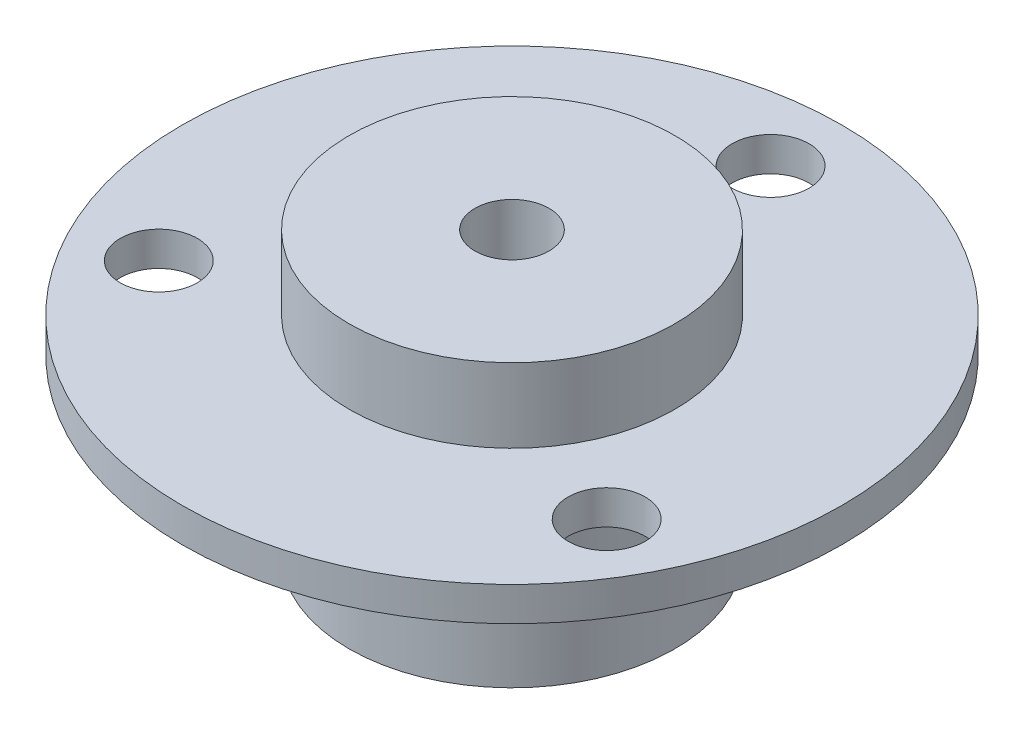
ISO-10303-21;
HEADER;
FILE_DESCRIPTION(('STEP AP214'),'2;1');
FILE_NAME('part.step','',(''),(''),'','','');
FILE_SCHEMA(('AUTOMOTIVE_DESIGN { 1 0 10303 214 1 1 1 1 }'));
ENDSEC;
DATA;
#1=APPLICATION_CONTEXT('core data for automotive mechanical design processes');
#2=APPLICATION_PROTOCOL_DEFINITION('international standard','automotive_design',2000,#1);
#3=PRODUCT_CONTEXT('',#1,'mechanical');
#4=PRODUCT('Part','Part','',(#3));
#5=PRODUCT_RELATED_PRODUCT_CATEGORY('part','',(#4));
#6=PRODUCT_DEFINITION_FORMATION('','',#4);
#7=PRODUCT_DEFINITION_CONTEXT('part definition',#1,'design');
#8=PRODUCT_DEFINITION('design','',#6,#7);
#9=PRODUCT_DEFINITION_SHAPE('','',#8);
#10=(LENGTH_UNIT() NAMED_UNIT(*) SI_UNIT(.MILLI.,.METRE.));
#11=(NAMED_UNIT(*) PLANE_ANGLE_UNIT() SI_UNIT($,.RADIAN.));
#12=(NAMED_UNIT(*) SI_UNIT($,.STERADIAN.) SOLID_ANGLE_UNIT());
#13=UNCERTAINTY_MEASURE_WITH_UNIT(LENGTH_MEASURE(1.E-05),#10,'distance_accuracy_value','');
#14=(GEOMETRIC_REPRESENTATION_CONTEXT(3) GLOBAL_UNCERTAINTY_ASSIGNED_CONTEXT((#13)) GLOBAL_UNIT_ASSIGNED_CONTEXT((#10,
#11,#12)) REPRESENTATION_CONTEXT('',''));
#15=CARTESIAN_POINT('',(0.,0.,0.));
#16=DIRECTION('',(0.,0.,1.));
#17=DIRECTION('',(1.,0.,0.));
#18=AXIS2_PLACEMENT_3D('',#15,#16,#17);
#19=CARTESIAN_POINT('',(0.,-19.,0.));
#20=DIRECTION('',(0.,1.,0.));
#21=DIRECTION('',(0.,0.,1.));
#22=AXIS2_PLACEMENT_3D('',#19,#20,#21);
#23=CYLINDRICAL_SURFACE('',#22,11.);
#24=CARTESIAN_POINT('',(0.,-19.,0.));
#25=DIRECTION('',(0.,1.,0.));
#26=DIRECTION('',(0.,0.,1.));
#27=AXIS2_PLACEMENT_3D('',#24,#25,#26);
#28=CIRCLE('',#27,11.);
#29=CARTESIAN_POINT('',(0.,-19.,11.));
#30=VERTEX_POINT('',#29);
#31=EDGE_CURVE('E41',#30,#30,#28,.T.);
#32=ORIENTED_EDGE('',*,*,#31,.T.);
#33=EDGE_LOOP('',(#32));
#34=FACE_BOUND('',#33,.T.);
#35=CARTESIAN_POINT('',(0.,-7.3,0.));
#36=DIRECTION('',(0.,1.,0.));
#37=DIRECTION('',(0.,0.,1.));
#38=AXIS2_PLACEMENT_3D('',#35,#36,#37);
#39=CIRCLE('',#38,11.);
#40=CARTESIAN_POINT('',(0.,-7.3,11.));
#41=VERTEX_POINT('',#40);
#42=EDGE_CURVE('E37',#41,#41,#39,.F.);
#43=ORIENTED_EDGE('',*,*,#42,.T.);
#44=EDGE_LOOP('',(#43));
#45=FACE_BOUND('',#44,.T.);
#46=ADVANCED_FACE('F33',(#34,#45),#23,.T.);
#47=CARTESIAN_POINT('',(0.,-19.,0.));
#48=DIRECTION('',(0.,1.,0.));
#49=DIRECTION('',(0.,0.,1.));
#50=AXIS2_PLACEMENT_3D('',#47,#48,#49);
#51=PLANE('',#50);
#52=CARTESIAN_POINT('',(0.,-19.,0.));
#53=DIRECTION('',(0.,1.,0.));
#54=DIRECTION('',(0.,0.,1.));
#55=AXIS2_PLACEMENT_3D('',#52,#53,#54);
#56=CIRCLE('',#55,2.5);
#57=CARTESIAN_POINT('',(0.,-19.,2.5));
#58=VERTEX_POINT('',#57);
#59=EDGE_CURVE('E70',#58,#58,#56,.T.);
#60=ORIENTED_EDGE('',*,*,#59,.T.);
#61=EDGE_LOOP('',(#60));
#62=FACE_BOUND('',#61,.T.);
#63=ORIENTED_EDGE('',*,*,#31,.F.);
#64=EDGE_LOOP('',(#63));
#65=FACE_BOUND('',#64,.T.);
#66=ADVANCED_FACE('F81',(#62,#65),#51,.F.);
#67=CARTESIAN_POINT('',(0.,-7.3,0.));
#68=DIRECTION('',(0.,1.,0.));
#69=DIRECTION('',(0.,0.,1.));
#70=AXIS2_PLACEMENT_3D('',#67,#68,#69);
#71=CYLINDRICAL_SURFACE('',#70,22.25);
#72=CARTESIAN_POINT('',(0.,-7.3,0.));
#73=DIRECTION('',(0.,1.,0.));
#74=DIRECTION('',(0.,0.,1.));
#75=AXIS2_PLACEMENT_3D('',#72,#73,#74);
#76=CIRCLE('',#75,22.25);
#77=CARTESIAN_POINT('',(0.,-7.3,22.25));
#78=VERTEX_POINT('',#77);
#79=EDGE_CURVE('E53',#78,#78,#76,.T.);
#80=ORIENTED_EDGE('',*,*,#79,.T.);
#81=EDGE_LOOP('',(#80));
#82=FACE_BOUND('',#81,.T.);
#83=CARTESIAN_POINT('',(0.,-5.,0.));
#84=DIRECTION('',(0.,1.,0.));
#85=DIRECTION('',(0.,0.,1.));
#86=AXIS2_PLACEMENT_3D('',#83,#84,#85);
#87=CIRCLE('',#86,22.25);
#88=CARTESIAN_POINT('',(0.,-5.,22.25));
#89=VERTEX_POINT('',#88);
#90=EDGE_CURVE('E50',#89,#89,#87,.T.);
#91=ORIENTED_EDGE('',*,*,#90,.F.);
#92=EDGE_LOOP('',(#91));
#93=FACE_BOUND('',#92,.T.);
#94=ADVANCED_FACE('F113',(#82,#93),#71,.T.);
#95=CARTESIAN_POINT('',(0.,-7.3,0.));
#96=DIRECTION('',(0.,1.,0.));
#97=DIRECTION('',(0.,0.,1.));
#98=AXIS2_PLACEMENT_3D('',#95,#96,#97);
#99=PLANE('',#98);
#100=CARTESIAN_POINT('',(0.,-7.3,-17.45));
#101=DIRECTION('',(0.,1.,0.));
#102=DIRECTION('',(0.,0.,1.));
#103=AXIS2_PLACEMENT_3D('',#100,#101,#102);
#104=CIRCLE('',#103,2.6);
#105=CARTESIAN_POINT('',(0.,-7.3,-14.85));
#106=VERTEX_POINT('',#105);
#107=EDGE_CURVE('E54',#106,#106,#104,.T.);
#108=ORIENTED_EDGE('',*,*,#107,.T.);
#109=EDGE_LOOP('',(#108));
#110=FACE_BOUND('',#109,.T.);
#111=CARTESIAN_POINT('',(15.1121432960396,-7.3,8.72499999999936));
#112=DIRECTION('',(0.,1.,0.));
#113=DIRECTION('',(0.,0.,1.));
#114=AXIS2_PLACEMENT_3D('',#111,#112,#113);
#115=CIRCLE('',#114,2.60000000000095);
#116=CARTESIAN_POINT('',(15.1121432960396,-7.3,11.3250000000003));
#117=VERTEX_POINT('',#116);
#118=EDGE_CURVE('E59',#117,#117,#115,.T.);
#119=ORIENTED_EDGE('',*,*,#118,.T.);
#120=EDGE_LOOP('',(#119));
#121=FACE_BOUND('',#120,.T.);
#122=CARTESIAN_POINT('',(-15.1121432960373,-7.3,8.72500000000065));
#123=DIRECTION('',(0.,1.,0.));
#124=DIRECTION('',(0.,0.,1.));
#125=AXIS2_PLACEMENT_3D('',#122,#123,#124);
#126=CIRCLE('',#125,2.60000000000142);
#127=CARTESIAN_POINT('',(-15.1121432960373,-7.3,11.3250000000021));
#128=VERTEX_POINT('',#127);
#129=EDGE_CURVE('E62',#128,#128,#126,.T.);
#130=ORIENTED_EDGE('',*,*,#129,.T.);
#131=EDGE_LOOP('',(#130));
#132=FACE_BOUND('',#131,.T.);
#133=ORIENTED_EDGE('',*,*,#42,.F.);
#134=EDGE_LOOP('',(#133));
#135=FACE_BOUND('',#134,.T.);
#136=ORIENTED_EDGE('',*,*,#79,.F.);
#137=EDGE_LOOP('',(#136));
#138=FACE_BOUND('',#137,.T.);
#139=ADVANCED_FACE('F120',(#110,#121,#132,#135,#138),#99,.F.);
#140=CARTESIAN_POINT('',(0.,-5.,0.));
#141=DIRECTION('',(0.,1.,0.));
#142=DIRECTION('',(0.,0.,1.));
#143=AXIS2_PLACEMENT_3D('',#140,#141,#142);
#144=PLANE('',#143);
#145=CARTESIAN_POINT('',(0.,-5.,-17.45));
#146=DIRECTION('',(0.,1.,0.));
#147=DIRECTION('',(0.,0.,1.));
#148=AXIS2_PLACEMENT_3D('',#145,#146,#147);
#149=CIRCLE('',#148,2.6);
#150=CARTESIAN_POINT('',(0.,-5.,-14.85));
#151=VERTEX_POINT('',#150);
#152=EDGE_CURVE('E65',#151,#151,#149,.T.);
#153=ORIENTED_EDGE('',*,*,#152,.F.);
#154=EDGE_LOOP('',(#153));
#155=FACE_BOUND('',#154,.T.);
#156=CARTESIAN_POINT('',(15.1121432960396,-5.,8.72499999999936));
#157=DIRECTION('',(0.,1.,0.));
#158=DIRECTION('',(0.,0.,1.));
#159=AXIS2_PLACEMENT_3D('',#156,#157,#158);
#160=CIRCLE('',#159,2.60000000000095);
#161=CARTESIAN_POINT('',(15.1121432960396,-5.,11.3250000000003));
#162=VERTEX_POINT('',#161);
#163=EDGE_CURVE('E69',#162,#162,#160,.T.);
#164=ORIENTED_EDGE('',*,*,#163,.F.);
#165=EDGE_LOOP('',(#164));
#166=FACE_BOUND('',#165,.T.);
#167=CARTESIAN_POINT('',(-15.1121432960373,-5.,8.72500000000065));
#168=DIRECTION('',(0.,1.,0.));
#169=DIRECTION('',(0.,0.,1.));
#170=AXIS2_PLACEMENT_3D('',#167,#168,#169);
#171=CIRCLE('',#170,2.60000000000142);
#172=CARTESIAN_POINT('',(-15.1121432960373,-5.,11.3250000000021));
#173=VERTEX_POINT('',#172);
#174=EDGE_CURVE('E66',#173,#173,#171,.T.);
#175=ORIENTED_EDGE('',*,*,#174,.F.);
#176=EDGE_LOOP('',(#175));
#177=FACE_BOUND('',#176,.T.);
#178=CARTESIAN_POINT('',(0.,-5.,0.));
#179=DIRECTION('',(0.,1.,0.));
#180=DIRECTION('',(0.,0.,1.));
#181=AXIS2_PLACEMENT_3D('',#178,#179,#180);
#182=CIRCLE('',#181,11.);
#183=CARTESIAN_POINT('',(0.,-5.,11.));
#184=VERTEX_POINT('',#183);
#185=EDGE_CURVE('E10',#184,#184,#182,.F.);
#186=ORIENTED_EDGE('',*,*,#185,.T.);
#187=EDGE_LOOP('',(#186));
#188=FACE_BOUND('',#187,.T.);
#189=ORIENTED_EDGE('',*,*,#90,.T.);
#190=EDGE_LOOP('',(#189));
#191=FACE_BOUND('',#190,.T.);
#192=ADVANCED_FACE('F94',(#155,#166,#177,#188,#191),#144,.T.);
#193=CARTESIAN_POINT('',(0.,0.,0.));
#194=DIRECTION('',(0.,1.,0.));
#195=DIRECTION('',(0.,0.,1.));
#196=AXIS2_PLACEMENT_3D('',#193,#194,#195);
#197=PLANE('',#196);
#198=CARTESIAN_POINT('',(0.,0.,0.));
#199=DIRECTION('',(0.,1.,0.));
#200=DIRECTION('',(0.,0.,1.));
#201=AXIS2_PLACEMENT_3D('',#198,#199,#200);
#202=CIRCLE('',#201,2.5);
#203=CARTESIAN_POINT('',(0.,0.,2.5));
#204=VERTEX_POINT('',#203);
#205=EDGE_CURVE('E75',#204,#204,#202,.T.);
#206=ORIENTED_EDGE('',*,*,#205,.F.);
#207=EDGE_LOOP('',(#206));
#208=FACE_BOUND('',#207,.T.);
#209=CARTESIAN_POINT('',(0.,0.,0.));
#210=DIRECTION('',(0.,1.,0.));
#211=DIRECTION('',(0.,0.,1.));
#212=AXIS2_PLACEMENT_3D('',#209,#210,#211);
#213=CIRCLE('',#212,11.);
#214=CARTESIAN_POINT('',(0.,0.,11.));
#215=VERTEX_POINT('',#214);
#216=EDGE_CURVE('E45',#215,#215,#213,.T.);
#217=ORIENTED_EDGE('',*,*,#216,.T.);
#218=EDGE_LOOP('',(#217));
#219=FACE_BOUND('',#218,.T.);
#220=ADVANCED_FACE('F91',(#208,#219),#197,.T.);
#221=ORIENTED_EDGE('',*,*,#185,.F.);
#222=EDGE_LOOP('',(#221));
#223=FACE_BOUND('',#222,.T.);
#224=ORIENTED_EDGE('',*,*,#216,.F.);
#225=EDGE_LOOP('',(#224));
#226=FACE_BOUND('',#225,.T.);
#227=ADVANCED_FACE('F35',(#223,#226),#23,.T.);
#228=CARTESIAN_POINT('',(-15.1121432960373,-19.,8.72500000000065));
#229=DIRECTION('',(0.,1.,0.));
#230=DIRECTION('',(0.,0.,1.));
#231=AXIS2_PLACEMENT_3D('',#228,#229,#230);
#232=CYLINDRICAL_SURFACE('',#231,2.60000000000142);
#233=CARTESIAN_POINT('',(-15.1121432960373,-5.,11.3250000000021));
#234=CARTESIAN_POINT('',(-15.1121432960373,-5.02395833333333,11.3250000000021));
#235=CARTESIAN_POINT('',(-15.1121432960373,-5.04791666666667,11.3250000000021));
#236=CARTESIAN_POINT('',(-15.1121432960373,-5.09583333333333,11.3250000000021));
#237=CARTESIAN_POINT('',(-15.1121432960373,-5.11979166666667,11.3250000000021));
#238=CARTESIAN_POINT('',(-15.1121432960373,-5.16770833333333,11.3250000000021));
#239=CARTESIAN_POINT('',(-15.1121432960373,-5.19166666666667,11.3250000000021));
#240=CARTESIAN_POINT('',(-15.1121432960373,-5.23958333333333,11.3250000000021));
#241=CARTESIAN_POINT('',(-15.1121432960373,-5.26354166666667,11.3250000000021));
#242=CARTESIAN_POINT('',(-15.1121432960373,-5.31145833333333,11.3250000000021));
#243=CARTESIAN_POINT('',(-15.1121432960373,-5.33541666666667,11.3250000000021));
#244=CARTESIAN_POINT('',(-15.1121432960373,-5.38333333333333,11.3250000000021));
#245=CARTESIAN_POINT('',(-15.1121432960373,-5.40729166666667,11.3250000000021));
#246=CARTESIAN_POINT('',(-15.1121432960373,-5.45520833333333,11.3250000000021));
#247=CARTESIAN_POINT('',(-15.1121432960373,-5.47916666666667,11.3250000000021));
#248=CARTESIAN_POINT('',(-15.1121432960373,-5.52708333333333,11.3250000000021));
#249=CARTESIAN_POINT('',(-15.1121432960373,-5.55104166666667,11.3250000000021));
#250=CARTESIAN_POINT('',(-15.1121432960373,-5.59895833333333,11.3250000000021));
#251=CARTESIAN_POINT('',(-15.1121432960373,-5.62291666666667,11.3250000000021));
#252=CARTESIAN_POINT('',(-15.1121432960373,-5.67083333333333,11.3250000000021));
#253=CARTESIAN_POINT('',(-15.1121432960373,-5.69479166666667,11.3250000000021));
#254=CARTESIAN_POINT('',(-15.1121432960373,-5.74270833333333,11.3250000000021));
#255=CARTESIAN_POINT('',(-15.1121432960373,-5.76666666666667,11.3250000000021));
#256=CARTESIAN_POINT('',(-15.1121432960373,-5.81458333333333,11.3250000000021));
#257=CARTESIAN_POINT('',(-15.1121432960373,-5.83854166666667,11.3250000000021));
#258=CARTESIAN_POINT('',(-15.1121432960373,-5.88645833333333,11.3250000000021));
#259=CARTESIAN_POINT('',(-15.1121432960373,-5.91041666666667,11.3250000000021));
#260=CARTESIAN_POINT('',(-15.1121432960373,-5.95833333333333,11.3250000000021));
#261=CARTESIAN_POINT('',(-15.1121432960373,-5.98229166666667,11.3250000000021));
#262=CARTESIAN_POINT('',(-15.1121432960373,-6.03020833333333,11.3250000000021));
#263=CARTESIAN_POINT('',(-15.1121432960373,-6.05416666666667,11.3250000000021));
#264=CARTESIAN_POINT('',(-15.1121432960373,-6.10208333333333,11.3250000000021));
#265=CARTESIAN_POINT('',(-15.1121432960373,-6.12604166666667,11.3250000000021));
#266=CARTESIAN_POINT('',(-15.1121432960373,-6.17395833333333,11.3250000000021));
#267=CARTESIAN_POINT('',(-15.1121432960373,-6.19791666666667,11.3250000000021));
#268=CARTESIAN_POINT('',(-15.1121432960373,-6.24583333333334,11.3250000000021));
#269=CARTESIAN_POINT('',(-15.1121432960373,-6.26979166666667,11.3250000000021));
#270=CARTESIAN_POINT('',(-15.1121432960373,-6.31770833333333,11.3250000000021));
#271=CARTESIAN_POINT('',(-15.1121432960373,-6.34166666666667,11.3250000000021));
#272=CARTESIAN_POINT('',(-15.1121432960373,-6.38958333333334,11.3250000000021));
#273=CARTESIAN_POINT('',(-15.1121432960373,-6.41354166666667,11.3250000000021));
#274=CARTESIAN_POINT('',(-15.1121432960373,-6.46145833333333,11.3250000000021));
#275=CARTESIAN_POINT('',(-15.1121432960373,-6.48541666666667,11.3250000000021));
#276=CARTESIAN_POINT('',(-15.1121432960373,-6.53333333333333,11.3250000000021));
#277=CARTESIAN_POINT('',(-15.1121432960373,-6.55729166666667,11.3250000000021));
#278=CARTESIAN_POINT('',(-15.1121432960373,-6.60520833333334,11.3250000000021));
#279=CARTESIAN_POINT('',(-15.1121432960373,-6.62916666666667,11.3250000000021));
#280=CARTESIAN_POINT('',(-15.1121432960373,-6.67708333333333,11.3250000000021));
#281=CARTESIAN_POINT('',(-15.1121432960373,-6.70104166666667,11.3250000000021));
#282=CARTESIAN_POINT('',(-15.1121432960373,-6.74895833333334,11.3250000000021));
#283=CARTESIAN_POINT('',(-15.1121432960373,-6.77291666666667,11.3250000000021));
#284=CARTESIAN_POINT('',(-15.1121432960373,-6.82083333333334,11.3250000000021));
#285=CARTESIAN_POINT('',(-15.1121432960373,-6.84479166666667,11.3250000000021));
#286=CARTESIAN_POINT('',(-15.1121432960373,-6.89270833333333,11.3250000000021));
#287=CARTESIAN_POINT('',(-15.1121432960373,-6.91666666666667,11.3250000000021));
#288=CARTESIAN_POINT('',(-15.1121432960373,-6.96458333333334,11.3250000000021));
#289=CARTESIAN_POINT('',(-15.1121432960373,-6.98854166666667,11.3250000000021));
#290=CARTESIAN_POINT('',(-15.1121432960373,-7.03645833333334,11.3250000000021));
#291=CARTESIAN_POINT('',(-15.1121432960373,-7.06041666666667,11.3250000000021));
#292=CARTESIAN_POINT('',(-15.1121432960373,-7.10833333333334,11.3250000000021));
#293=CARTESIAN_POINT('',(-15.1121432960373,-7.13229166666667,11.3250000000021));
#294=CARTESIAN_POINT('',(-15.1121432960373,-7.18020833333334,11.3250000000021));
#295=CARTESIAN_POINT('',(-15.1121432960373,-7.20416666666667,11.3250000000021));
#296=CARTESIAN_POINT('',(-15.1121432960373,-7.25208333333334,11.3250000000021));
#297=CARTESIAN_POINT('',(-15.1121432960373,-7.27604166666667,11.3250000000021));
#298=CARTESIAN_POINT('',(-15.1121432960373,-7.3,11.3250000000021));
#299=B_SPLINE_CURVE_WITH_KNOTS('',3,(#233,#234,#235,#236,#237,#238,#239,#240,#241,#242,#243,
#244,#245,#246,#247,#248,#249,#250,#251,#252,#253,#254,#255,#256,#257,#258,#259,#260,#261,#262,
#263,#264,#265,#266,#267,#268,#269,#270,#271,#272,#273,#274,#275,#276,#277,#278,#279,#280,#281,
#282,#283,#284,#285,#286,#287,#288,#289,#290,#291,#292,#293,#294,#295,#296,#297,#298),
.UNSPECIFIED.,.F.,.F.,(4,2,2,2,2,2,2,2,2,2,2,2,2,2,2,2,2,2,2,2,2,2,2,2,2,2,2,2,2,2,2,2,4),(0.,
0.0718750000000008,0.14375,0.215625000000001,0.2875,0.359375,0.431250000000001,0.503125,
0.575000000000001,0.646875000000002,0.718750000000001,0.790625000000001,0.862500000000002,
0.934375000000001,1.00625,1.078125,1.15,1.221875,1.29375,1.365625,1.4375,1.509375,1.58125,
1.653125,1.725,1.796875,1.86875,1.940625,2.0125,2.084375,2.15625,2.228125,2.3),.UNSPECIFIED.);
#300=EDGE_CURVE('BSEAM98',#173,#128,#299,.T.);
#301=ORIENTED_EDGE('',*,*,#174,.T.);
#302=ORIENTED_EDGE('',*,*,#129,.F.);
#303=ORIENTED_EDGE('',*,*,#300,.T.);
#304=ORIENTED_EDGE('',*,*,#300,.F.);
#305=EDGE_LOOP('',(#301,#303,#302,#304));
#306=FACE_BOUND('',#305,.T.);
#307=ADVANCED_FACE('F98',(#306),#232,.F.);
#308=CARTESIAN_POINT('',(15.1121432960396,-19.,8.72499999999936));
#309=DIRECTION('',(0.,1.,0.));
#310=DIRECTION('',(0.,0.,1.));
#311=AXIS2_PLACEMENT_3D('',#308,#309,#310);
#312=CYLINDRICAL_SURFACE('',#311,2.60000000000095);
#313=CARTESIAN_POINT('',(15.1121432960396,-5.,11.3250000000003));
#314=CARTESIAN_POINT('',(15.1121432960396,-5.02395833333333,11.3250000000003));
#315=CARTESIAN_POINT('',(15.1121432960396,-5.04791666666667,11.3250000000003));
#316=CARTESIAN_POINT('',(15.1121432960396,-5.09583333333333,11.3250000000003));
#317=CARTESIAN_POINT('',(15.1121432960396,-5.11979166666667,11.3250000000003));
#318=CARTESIAN_POINT('',(15.1121432960396,-5.16770833333333,11.3250000000003));
#319=CARTESIAN_POINT('',(15.1121432960396,-5.19166666666667,11.3250000000003));
#320=CARTESIAN_POINT('',(15.1121432960396,-5.23958333333333,11.3250000000003));
#321=CARTESIAN_POINT('',(15.1121432960396,-5.26354166666667,11.3250000000003));
#322=CARTESIAN_POINT('',(15.1121432960396,-5.31145833333333,11.3250000000003));
#323=CARTESIAN_POINT('',(15.1121432960396,-5.33541666666667,11.3250000000003));
#324=CARTESIAN_POINT('',(15.1121432960396,-5.38333333333333,11.3250000000003));
#325=CARTESIAN_POINT('',(15.1121432960396,-5.40729166666667,11.3250000000003));
#326=CARTESIAN_POINT('',(15.1121432960396,-5.45520833333333,11.3250000000003));
#327=CARTESIAN_POINT('',(15.1121432960396,-5.47916666666667,11.3250000000003));
#328=CARTESIAN_POINT('',(15.1121432960396,-5.52708333333333,11.3250000000003));
#329=CARTESIAN_POINT('',(15.1121432960396,-5.55104166666667,11.3250000000003));
#330=CARTESIAN_POINT('',(15.1121432960396,-5.59895833333333,11.3250000000003));
#331=CARTESIAN_POINT('',(15.1121432960396,-5.62291666666667,11.3250000000003));
#332=CARTESIAN_POINT('',(15.1121432960396,-5.67083333333333,11.3250000000003));
#333=CARTESIAN_POINT('',(15.1121432960396,-5.69479166666667,11.3250000000003));
#334=CARTESIAN_POINT('',(15.1121432960396,-5.74270833333333,11.3250000000003));
#335=CARTESIAN_POINT('',(15.1121432960396,-5.76666666666667,11.3250000000003));
#336=CARTESIAN_POINT('',(15.1121432960396,-5.81458333333333,11.3250000000003));
#337=CARTESIAN_POINT('',(15.1121432960396,-5.83854166666667,11.3250000000003));
#338=CARTESIAN_POINT('',(15.1121432960396,-5.88645833333333,11.3250000000003));
#339=CARTESIAN_POINT('',(15.1121432960396,-5.91041666666667,11.3250000000003));
#340=CARTESIAN_POINT('',(15.1121432960396,-5.95833333333333,11.3250000000003));
#341=CARTESIAN_POINT('',(15.1121432960396,-5.98229166666667,11.3250000000003));
#342=CARTESIAN_POINT('',(15.1121432960396,-6.03020833333333,11.3250000000003));
#343=CARTESIAN_POINT('',(15.1121432960396,-6.05416666666667,11.3250000000003));
#344=CARTESIAN_POINT('',(15.1121432960396,-6.10208333333333,11.3250000000003));
#345=CARTESIAN_POINT('',(15.1121432960396,-6.12604166666667,11.3250000000003));
#346=CARTESIAN_POINT('',(15.1121432960396,-6.17395833333333,11.3250000000003));
#347=CARTESIAN_POINT('',(15.1121432960396,-6.19791666666667,11.3250000000003));
#348=CARTESIAN_POINT('',(15.1121432960396,-6.24583333333334,11.3250000000003));
#349=CARTESIAN_POINT('',(15.1121432960396,-6.26979166666667,11.3250000000003));
#350=CARTESIAN_POINT('',(15.1121432960396,-6.31770833333333,11.3250000000003));
#351=CARTESIAN_POINT('',(15.1121432960396,-6.34166666666667,11.3250000000003));
#352=CARTESIAN_POINT('',(15.1121432960396,-6.38958333333334,11.3250000000003));
#353=CARTESIAN_POINT('',(15.1121432960396,-6.41354166666667,11.3250000000003));
#354=CARTESIAN_POINT('',(15.1121432960396,-6.46145833333333,11.3250000000003));
#355=CARTESIAN_POINT('',(15.1121432960396,-6.48541666666667,11.3250000000003));
#356=CARTESIAN_POINT('',(15.1121432960396,-6.53333333333333,11.3250000000003));
#357=CARTESIAN_POINT('',(15.1121432960396,-6.55729166666667,11.3250000000003));
#358=CARTESIAN_POINT('',(15.1121432960396,-6.60520833333334,11.3250000000003));
#359=CARTESIAN_POINT('',(15.1121432960396,-6.62916666666667,11.3250000000003));
#360=CARTESIAN_POINT('',(15.1121432960396,-6.67708333333333,11.3250000000003));
#361=CARTESIAN_POINT('',(15.1121432960396,-6.70104166666667,11.3250000000003));
#362=CARTESIAN_POINT('',(15.1121432960396,-6.74895833333334,11.3250000000003));
#363=CARTESIAN_POINT('',(15.1121432960396,-6.77291666666667,11.3250000000003));
#364=CARTESIAN_POINT('',(15.1121432960396,-6.82083333333334,11.3250000000003));
#365=CARTESIAN_POINT('',(15.1121432960396,-6.84479166666667,11.3250000000003));
#366=CARTESIAN_POINT('',(15.1121432960396,-6.89270833333333,11.3250000000003));
#367=CARTESIAN_POINT('',(15.1121432960396,-6.91666666666667,11.3250000000003));
#368=CARTESIAN_POINT('',(15.1121432960396,-6.96458333333334,11.3250000000003));
#369=CARTESIAN_POINT('',(15.1121432960396,-6.98854166666667,11.3250000000003));
#370=CARTESIAN_POINT('',(15.1121432960396,-7.03645833333334,11.3250000000003));
#371=CARTESIAN_POINT('',(15.1121432960396,-7.06041666666667,11.3250000000003));
#372=CARTESIAN_POINT('',(15.1121432960396,-7.10833333333334,11.3250000000003));
#373=CARTESIAN_POINT('',(15.1121432960396,-7.13229166666667,11.3250000000003));
#374=CARTESIAN_POINT('',(15.1121432960396,-7.18020833333334,11.3250000000003));
#375=CARTESIAN_POINT('',(15.1121432960396,-7.20416666666667,11.3250000000003));
#376=CARTESIAN_POINT('',(15.1121432960396,-7.25208333333334,11.3250000000003));
#377=CARTESIAN_POINT('',(15.1121432960396,-7.27604166666667,11.3250000000003));
#378=CARTESIAN_POINT('',(15.1121432960396,-7.3,11.3250000000003));
#379=B_SPLINE_CURVE_WITH_KNOTS('',3,(#313,#314,#315,#316,#317,#318,#319,#320,#321,#322,#323,
#324,#325,#326,#327,#328,#329,#330,#331,#332,#333,#334,#335,#336,#337,#338,#339,#340,#341,#342,
#343,#344,#345,#346,#347,#348,#349,#350,#351,#352,#353,#354,#355,#356,#357,#358,#359,#360,#361,
#362,#363,#364,#365,#366,#367,#368,#369,#370,#371,#372,#373,#374,#375,#376,#377,#378),
.UNSPECIFIED.,.F.,.F.,(4,2,2,2,2,2,2,2,2,2,2,2,2,2,2,2,2,2,2,2,2,2,2,2,2,2,2,2,2,2,2,2,4),(0.,
0.0718750000000008,0.14375,0.215625000000001,0.2875,0.359375,0.431250000000001,0.503125,
0.575000000000001,0.646875000000002,0.718750000000001,0.790625000000001,0.862500000000002,
0.934375000000001,1.00625,1.078125,1.15,1.221875,1.29375,1.365625,1.4375,1.509375,1.58125,
1.653125,1.725,1.796875,1.86875,1.940625,2.0125,2.084375,2.15625,2.228125,2.3),.UNSPECIFIED.);
#380=EDGE_CURVE('BSEAM104',#162,#117,#379,.T.);
#381=ORIENTED_EDGE('',*,*,#163,.T.);
#382=ORIENTED_EDGE('',*,*,#118,.F.);
#383=ORIENTED_EDGE('',*,*,#380,.T.);
#384=ORIENTED_EDGE('',*,*,#380,.F.);
#385=EDGE_LOOP('',(#381,#383,#382,#384));
#386=FACE_BOUND('',#385,.T.);
#387=ADVANCED_FACE('F104',(#386),#312,.F.);
#388=CARTESIAN_POINT('',(0.,-19.,-17.45));
#389=DIRECTION('',(0.,1.,0.));
#390=DIRECTION('',(0.,0.,1.));
#391=AXIS2_PLACEMENT_3D('',#388,#389,#390);
#392=CYLINDRICAL_SURFACE('',#391,2.6);
#393=CARTESIAN_POINT('',(0.,-5.,-14.85));
#394=CARTESIAN_POINT('',(0.,-5.02395833333333,-14.85));
#395=CARTESIAN_POINT('',(0.,-5.04791666666667,-14.85));
#396=CARTESIAN_POINT('',(0.,-5.09583333333333,-14.85));
#397=CARTESIAN_POINT('',(0.,-5.11979166666667,-14.85));
#398=CARTESIAN_POINT('',(0.,-5.16770833333333,-14.85));
#399=CARTESIAN_POINT('',(0.,-5.19166666666667,-14.85));
#400=CARTESIAN_POINT('',(0.,-5.23958333333333,-14.85));
#401=CARTESIAN_POINT('',(0.,-5.26354166666667,-14.85));
#402=CARTESIAN_POINT('',(0.,-5.31145833333333,-14.85));
#403=CARTESIAN_POINT('',(0.,-5.33541666666667,-14.85));
#404=CARTESIAN_POINT('',(0.,-5.38333333333333,-14.85));
#405=CARTESIAN_POINT('',(0.,-5.40729166666667,-14.85));
#406=CARTESIAN_POINT('',(0.,-5.45520833333333,-14.85));
#407=CARTESIAN_POINT('',(0.,-5.47916666666667,-14.85));
#408=CARTESIAN_POINT('',(0.,-5.52708333333333,-14.85));
#409=CARTESIAN_POINT('',(0.,-5.55104166666667,-14.85));
#410=CARTESIAN_POINT('',(0.,-5.59895833333333,-14.85));
#411=CARTESIAN_POINT('',(0.,-5.62291666666667,-14.85));
#412=CARTESIAN_POINT('',(0.,-5.67083333333333,-14.85));
#413=CARTESIAN_POINT('',(0.,-5.69479166666667,-14.85));
#414=CARTESIAN_POINT('',(0.,-5.74270833333333,-14.85));
#415=CARTESIAN_POINT('',(0.,-5.76666666666667,-14.85));
#416=CARTESIAN_POINT('',(0.,-5.81458333333333,-14.85));
#417=CARTESIAN_POINT('',(0.,-5.83854166666667,-14.85));
#418=CARTESIAN_POINT('',(0.,-5.88645833333333,-14.85));
#419=CARTESIAN_POINT('',(0.,-5.91041666666667,-14.85));
#420=CARTESIAN_POINT('',(0.,-5.95833333333333,-14.85));
#421=CARTESIAN_POINT('',(0.,-5.98229166666667,-14.85));
#422=CARTESIAN_POINT('',(0.,-6.03020833333333,-14.85));
#423=CARTESIAN_POINT('',(0.,-6.05416666666667,-14.85));
#424=CARTESIAN_POINT('',(0.,-6.10208333333333,-14.85));
#425=CARTESIAN_POINT('',(0.,-6.12604166666667,-14.85));
#426=CARTESIAN_POINT('',(0.,-6.17395833333333,-14.85));
#427=CARTESIAN_POINT('',(0.,-6.19791666666667,-14.85));
#428=CARTESIAN_POINT('',(0.,-6.24583333333334,-14.85));
#429=CARTESIAN_POINT('',(0.,-6.26979166666667,-14.85));
#430=CARTESIAN_POINT('',(0.,-6.31770833333333,-14.85));
#431=CARTESIAN_POINT('',(0.,-6.34166666666667,-14.85));
#432=CARTESIAN_POINT('',(0.,-6.38958333333334,-14.85));
#433=CARTESIAN_POINT('',(0.,-6.41354166666667,-14.85));
#434=CARTESIAN_POINT('',(0.,-6.46145833333333,-14.85));
#435=CARTESIAN_POINT('',(0.,-6.48541666666667,-14.85));
#436=CARTESIAN_POINT('',(0.,-6.53333333333333,-14.85));
#437=CARTESIAN_POINT('',(0.,-6.55729166666667,-14.85));
#438=CARTESIAN_POINT('',(0.,-6.60520833333334,-14.85));
#439=CARTESIAN_POINT('',(0.,-6.62916666666667,-14.85));
#440=CARTESIAN_POINT('',(0.,-6.67708333333333,-14.85));
#441=CARTESIAN_POINT('',(0.,-6.70104166666667,-14.85));
#442=CARTESIAN_POINT('',(0.,-6.74895833333334,-14.85));
#443=CARTESIAN_POINT('',(0.,-6.77291666666667,-14.85));
#444=CARTESIAN_POINT('',(0.,-6.82083333333334,-14.85));
#445=CARTESIAN_POINT('',(0.,-6.84479166666667,-14.85));
#446=CARTESIAN_POINT('',(0.,-6.89270833333333,-14.85));
#447=CARTESIAN_POINT('',(0.,-6.91666666666667,-14.85));
#448=CARTESIAN_POINT('',(0.,-6.96458333333334,-14.85));
#449=CARTESIAN_POINT('',(0.,-6.98854166666667,-14.85));
#450=CARTESIAN_POINT('',(0.,-7.03645833333334,-14.85));
#451=CARTESIAN_POINT('',(0.,-7.06041666666667,-14.85));
#452=CARTESIAN_POINT('',(0.,-7.10833333333334,-14.85));
#453=CARTESIAN_POINT('',(0.,-7.13229166666667,-14.85));
#454=CARTESIAN_POINT('',(0.,-7.18020833333334,-14.85));
#455=CARTESIAN_POINT('',(0.,-7.20416666666667,-14.85));
#456=CARTESIAN_POINT('',(0.,-7.25208333333334,-14.85));
#457=CARTESIAN_POINT('',(0.,-7.27604166666667,-14.85));
#458=CARTESIAN_POINT('',(0.,-7.3,-14.85));
#459=B_SPLINE_CURVE_WITH_KNOTS('',3,(#393,#394,#395,#396,#397,#398,#399,#400,#401,#402,#403,
#404,#405,#406,#407,#408,#409,#410,#411,#412,#413,#414,#415,#416,#417,#418,#419,#420,#421,#422,
#423,#424,#425,#426,#427,#428,#429,#430,#431,#432,#433,#434,#435,#436,#437,#438,#439,#440,#441,
#442,#443,#444,#445,#446,#447,#448,#449,#450,#451,#452,#453,#454,#455,#456,#457,#458),
.UNSPECIFIED.,.F.,.F.,(4,2,2,2,2,2,2,2,2,2,2,2,2,2,2,2,2,2,2,2,2,2,2,2,2,2,2,2,2,2,2,2,4),(0.,
0.0718750000000008,0.14375,0.215625000000001,0.2875,0.359375,0.431250000000001,0.503125,
0.575000000000001,0.646875000000002,0.718750000000001,0.790625000000001,0.862500000000002,
0.934375000000001,1.00625,1.078125,1.15,1.221875,1.29375,1.365625,1.4375,1.509375,1.58125,
1.653125,1.725,1.796875,1.86875,1.940625,2.0125,2.084375,2.15625,2.228125,2.3),.UNSPECIFIED.);
#460=EDGE_CURVE('BSEAM87',#151,#106,#459,.T.);
#461=ORIENTED_EDGE('',*,*,#152,.T.);
#462=ORIENTED_EDGE('',*,*,#107,.F.);
#463=ORIENTED_EDGE('',*,*,#460,.T.);
#464=ORIENTED_EDGE('',*,*,#460,.F.);
#465=EDGE_LOOP('',(#461,#463,#462,#464));
#466=FACE_BOUND('',#465,.T.);
#467=ADVANCED_FACE('F87',(#466),#392,.F.);
#468=CARTESIAN_POINT('',(0.,-19.,0.));
#469=DIRECTION('',(0.,1.,0.));
#470=DIRECTION('',(0.,0.,1.));
#471=AXIS2_PLACEMENT_3D('',#468,#469,#470);
#472=CYLINDRICAL_SURFACE('',#471,2.5);
#473=ORIENTED_EDGE('',*,*,#59,.F.);
#474=EDGE_LOOP('',(#473));
#475=FACE_BOUND('',#474,.T.);
#476=ORIENTED_EDGE('',*,*,#205,.T.);
#477=EDGE_LOOP('',(#476));
#478=FACE_BOUND('',#477,.T.);
#479=ADVANCED_FACE('F84',(#475,#478),#472,.F.);
#480=CLOSED_SHELL('',(#46,#66,#94,#139,#192,#220,#227,#307,#387,#467,#479));
#481=MANIFOLD_SOLID_BREP('B2',#480);
#482=ADVANCED_BREP_SHAPE_REPRESENTATION('',(#18,#481),#14);
#483=SHAPE_DEFINITION_REPRESENTATION(#9,#482);
ENDSEC;
END-ISO-10303-21;
